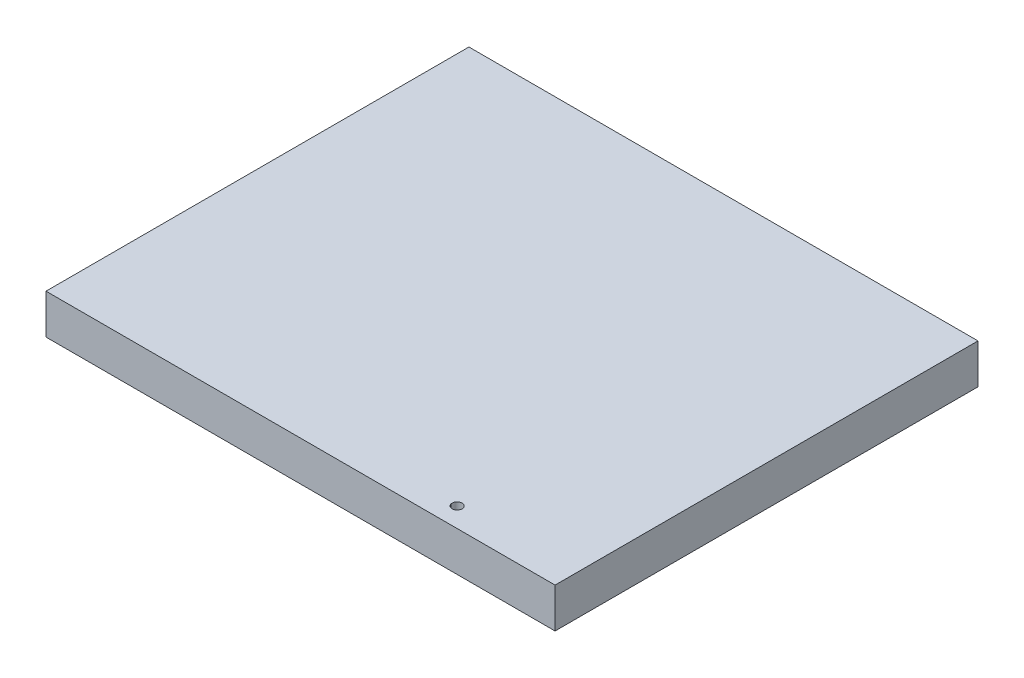
ISO-10303-21;
HEADER;
FILE_DESCRIPTION(('STEP AP214'),'2;1');
FILE_NAME('part.step','',(''),(''),'','','');
FILE_SCHEMA(('AUTOMOTIVE_DESIGN { 1 0 10303 214 1 1 1 1 }'));
ENDSEC;
DATA;
#1=APPLICATION_CONTEXT('core data for automotive mechanical design processes');
#2=APPLICATION_PROTOCOL_DEFINITION('international standard','automotive_design',2000,#1);
#3=PRODUCT_CONTEXT('',#1,'mechanical');
#4=PRODUCT('Part','Part','',(#3));
#5=PRODUCT_RELATED_PRODUCT_CATEGORY('part','',(#4));
#6=PRODUCT_DEFINITION_FORMATION('','',#4);
#7=PRODUCT_DEFINITION_CONTEXT('part definition',#1,'design');
#8=PRODUCT_DEFINITION('design','',#6,#7);
#9=PRODUCT_DEFINITION_SHAPE('','',#8);
#10=(LENGTH_UNIT() NAMED_UNIT(*) SI_UNIT(.MILLI.,.METRE.));
#11=(NAMED_UNIT(*) PLANE_ANGLE_UNIT() SI_UNIT($,.RADIAN.));
#12=(NAMED_UNIT(*) SI_UNIT($,.STERADIAN.) SOLID_ANGLE_UNIT());
#13=UNCERTAINTY_MEASURE_WITH_UNIT(LENGTH_MEASURE(1.E-05),#10,'distance_accuracy_value','');
#14=(GEOMETRIC_REPRESENTATION_CONTEXT(3) GLOBAL_UNCERTAINTY_ASSIGNED_CONTEXT((#13)) GLOBAL_UNIT_ASSIGNED_CONTEXT((#10,
#11,#12)) REPRESENTATION_CONTEXT('',''));
#15=CARTESIAN_POINT('',(0.,0.,0.));
#16=DIRECTION('',(0.,0.,1.));
#17=DIRECTION('',(1.,0.,0.));
#18=AXIS2_PLACEMENT_3D('',#15,#16,#17);
#19=CARTESIAN_POINT('',(-145.794398743962,25.4,-109.8836222286));
#20=DIRECTION('',(1.,0.,0.));
#21=DIRECTION('',(0.,0.,-1.));
#22=AXIS2_PLACEMENT_3D('',#19,#20,#21);
#23=PLANE('',#22);
#24=DIRECTION('',(0.,0.,1.));
#25=VECTOR('',#24,1.);
#26=CARTESIAN_POINT('',(-145.794398743962,0.,-109.8836222286));
#27=LINE('',#26,#25);
#28=CARTESIAN_POINT('',(-145.794398743962,0.,-109.8836222286));
#29=VERTEX_POINT('',#28);
#30=CARTESIAN_POINT('',(-145.794398743962,0.,160.1163777714));
#31=VERTEX_POINT('',#30);
#32=EDGE_CURVE('E96',#29,#31,#27,.T.);
#33=ORIENTED_EDGE('',*,*,#32,.T.);
#34=DIRECTION('',(0.,-1.,0.));
#35=VECTOR('',#34,1.);
#36=CARTESIAN_POINT('',(-145.794398743962,25.4,160.1163777714));
#37=LINE('',#36,#35);
#38=CARTESIAN_POINT('',(-145.794398743962,25.4,160.1163777714));
#39=VERTEX_POINT('',#38);
#40=EDGE_CURVE('E11',#39,#31,#37,.T.);
#41=ORIENTED_EDGE('',*,*,#40,.F.);
#42=DIRECTION('',(0.,0.,1.));
#43=VECTOR('',#42,1.);
#44=CARTESIAN_POINT('',(-145.794398743962,25.4,-109.8836222286));
#45=LINE('',#44,#43);
#46=CARTESIAN_POINT('',(-145.794398743962,25.4,-109.8836222286));
#47=VERTEX_POINT('',#46);
#48=EDGE_CURVE('E84',#47,#39,#45,.T.);
#49=ORIENTED_EDGE('',*,*,#48,.F.);
#50=DIRECTION('',(0.,-1.,0.));
#51=VECTOR('',#50,1.);
#52=CARTESIAN_POINT('',(-145.794398743962,25.4,-109.8836222286));
#53=LINE('',#52,#51);
#54=EDGE_CURVE('E92',#47,#29,#53,.T.);
#55=ORIENTED_EDGE('',*,*,#54,.T.);
#56=EDGE_LOOP('',(#33,#41,#49,#55));
#57=FACE_BOUND('',#56,.T.);
#58=ADVANCED_FACE('F33',(#57),#23,.F.);
#59=CARTESIAN_POINT('',(-145.794398743962,25.4,160.1163777714));
#60=DIRECTION('',(0.,0.,-1.));
#61=DIRECTION('',(-1.,0.,0.));
#62=AXIS2_PLACEMENT_3D('',#59,#60,#61);
#63=PLANE('',#62);
#64=DIRECTION('',(1.,0.,0.));
#65=VECTOR('',#64,1.);
#66=CARTESIAN_POINT('',(-145.794398743962,0.,160.1163777714));
#67=LINE('',#66,#65);
#68=CARTESIAN_POINT('',(179.205601256039,0.,160.1163777714));
#69=VERTEX_POINT('',#68);
#70=EDGE_CURVE('E88',#31,#69,#67,.T.);
#71=ORIENTED_EDGE('',*,*,#70,.T.);
#72=DIRECTION('',(0.,-1.,0.));
#73=VECTOR('',#72,1.);
#74=CARTESIAN_POINT('',(179.205601256039,25.4,160.1163777714));
#75=LINE('',#74,#73);
#76=CARTESIAN_POINT('',(179.205601256039,25.4,160.1163777714));
#77=VERTEX_POINT('',#76);
#78=EDGE_CURVE('E41',#77,#69,#75,.T.);
#79=ORIENTED_EDGE('',*,*,#78,.F.);
#80=DIRECTION('',(1.,0.,0.));
#81=VECTOR('',#80,1.);
#82=CARTESIAN_POINT('',(-145.794398743962,25.4,160.1163777714));
#83=LINE('',#82,#81);
#84=EDGE_CURVE('E79',#39,#77,#83,.T.);
#85=ORIENTED_EDGE('',*,*,#84,.F.);
#86=ORIENTED_EDGE('',*,*,#40,.T.);
#87=EDGE_LOOP('',(#71,#79,#85,#86));
#88=FACE_BOUND('',#87,.T.);
#89=ADVANCED_FACE('F87',(#88),#63,.F.);
#90=CARTESIAN_POINT('',(179.205601256039,25.4,-109.8836222286));
#91=DIRECTION('',(-1.,0.,0.));
#92=DIRECTION('',(0.,0.,1.));
#93=AXIS2_PLACEMENT_3D('',#90,#91,#92);
#94=PLANE('',#93);
#95=DIRECTION('',(0.,0.,-1.));
#96=VECTOR('',#95,1.);
#97=CARTESIAN_POINT('',(179.205601256039,0.,-109.8836222286));
#98=LINE('',#97,#96);
#99=CARTESIAN_POINT('',(179.205601256039,0.,-109.8836222286));
#100=VERTEX_POINT('',#99);
#101=EDGE_CURVE('E66',#69,#100,#98,.T.);
#102=ORIENTED_EDGE('',*,*,#101,.T.);
#103=DIRECTION('',(0.,-1.,0.));
#104=VECTOR('',#103,1.);
#105=CARTESIAN_POINT('',(179.205601256039,25.4,-109.8836222286));
#106=LINE('',#105,#104);
#107=CARTESIAN_POINT('',(179.205601256039,25.4,-109.8836222286));
#108=VERTEX_POINT('',#107);
#109=EDGE_CURVE('E89',#108,#100,#106,.T.);
#110=ORIENTED_EDGE('',*,*,#109,.F.);
#111=DIRECTION('',(0.,0.,-1.));
#112=VECTOR('',#111,1.);
#113=CARTESIAN_POINT('',(179.205601256039,25.4,-109.8836222286));
#114=LINE('',#113,#112);
#115=EDGE_CURVE('E82',#77,#108,#114,.T.);
#116=ORIENTED_EDGE('',*,*,#115,.F.);
#117=ORIENTED_EDGE('',*,*,#78,.T.);
#118=EDGE_LOOP('',(#102,#110,#116,#117));
#119=FACE_BOUND('',#118,.T.);
#120=ADVANCED_FACE('F90',(#119),#94,.F.);
#121=CARTESIAN_POINT('',(-145.794398743962,25.4,-109.8836222286));
#122=DIRECTION('',(0.,0.,1.));
#123=DIRECTION('',(1.,0.,0.));
#124=AXIS2_PLACEMENT_3D('',#121,#122,#123);
#125=PLANE('',#124);
#126=DIRECTION('',(-1.,0.,0.));
#127=VECTOR('',#126,1.);
#128=CARTESIAN_POINT('',(-145.794398743962,0.,-109.8836222286));
#129=LINE('',#128,#127);
#130=EDGE_CURVE('E72',#100,#29,#129,.T.);
#131=ORIENTED_EDGE('',*,*,#130,.T.);
#132=ORIENTED_EDGE('',*,*,#54,.F.);
#133=DIRECTION('',(-1.,0.,0.));
#134=VECTOR('',#133,1.);
#135=CARTESIAN_POINT('',(-145.794398743962,25.4,-109.8836222286));
#136=LINE('',#135,#134);
#137=EDGE_CURVE('E49',#108,#47,#136,.T.);
#138=ORIENTED_EDGE('',*,*,#137,.F.);
#139=ORIENTED_EDGE('',*,*,#109,.T.);
#140=EDGE_LOOP('',(#131,#132,#138,#139));
#141=FACE_BOUND('',#140,.T.);
#142=ADVANCED_FACE('F104',(#141),#125,.F.);
#143=CARTESIAN_POINT('',(0.,25.4,0.));
#144=DIRECTION('',(0.,1.,0.));
#145=DIRECTION('',(0.,0.,1.));
#146=AXIS2_PLACEMENT_3D('',#143,#144,#145);
#147=PLANE('',#146);
#148=CARTESIAN_POINT('',(104.205601256039,25.4,147.6163777714));
#149=DIRECTION('',(0.,1.,0.));
#150=DIRECTION('',(0.,0.,1.));
#151=AXIS2_PLACEMENT_3D('',#148,#149,#150);
#152=CIRCLE('',#151,3.20000000000001);
#153=CARTESIAN_POINT('',(104.205601256039,25.4,150.8163777714));
#154=VERTEX_POINT('',#153);
#155=EDGE_CURVE('E110',#154,#154,#152,.T.);
#156=ORIENTED_EDGE('',*,*,#155,.F.);
#157=EDGE_LOOP('',(#156));
#158=FACE_BOUND('',#157,.T.);
#159=ORIENTED_EDGE('',*,*,#48,.T.);
#160=ORIENTED_EDGE('',*,*,#84,.T.);
#161=ORIENTED_EDGE('',*,*,#115,.T.);
#162=ORIENTED_EDGE('',*,*,#137,.T.);
#163=EDGE_LOOP('',(#159,#160,#161,#162));
#164=FACE_BOUND('',#163,.T.);
#165=ADVANCED_FACE('F80',(#158,#164),#147,.T.);
#166=CARTESIAN_POINT('',(0.,0.,0.));
#167=DIRECTION('',(0.,1.,0.));
#168=DIRECTION('',(0.,0.,1.));
#169=AXIS2_PLACEMENT_3D('',#166,#167,#168);
#170=PLANE('',#169);
#171=CARTESIAN_POINT('',(104.205601256039,0.,147.6163777714));
#172=DIRECTION('',(0.,1.,0.));
#173=DIRECTION('',(0.,0.,1.));
#174=AXIS2_PLACEMENT_3D('',#171,#172,#173);
#175=CIRCLE('',#174,3.20000000000001);
#176=CARTESIAN_POINT('',(104.205601256039,0.,150.8163777714));
#177=VERTEX_POINT('',#176);
#178=EDGE_CURVE('E99',#177,#177,#175,.T.);
#179=ORIENTED_EDGE('',*,*,#178,.T.);
#180=EDGE_LOOP('',(#179));
#181=FACE_BOUND('',#180,.T.);
#182=ORIENTED_EDGE('',*,*,#32,.F.);
#183=ORIENTED_EDGE('',*,*,#130,.F.);
#184=ORIENTED_EDGE('',*,*,#101,.F.);
#185=ORIENTED_EDGE('',*,*,#70,.F.);
#186=EDGE_LOOP('',(#182,#183,#184,#185));
#187=FACE_BOUND('',#186,.T.);
#188=ADVANCED_FACE('F107',(#181,#187),#170,.F.);
#189=CARTESIAN_POINT('',(104.205601256039,0.,147.6163777714));
#190=DIRECTION('',(0.,1.,0.));
#191=DIRECTION('',(0.,0.,1.));
#192=AXIS2_PLACEMENT_3D('',#189,#190,#191);
#193=CYLINDRICAL_SURFACE('',#192,3.20000000000001);
#194=ORIENTED_EDGE('',*,*,#178,.F.);
#195=EDGE_LOOP('',(#194));
#196=FACE_BOUND('',#195,.T.);
#197=ORIENTED_EDGE('',*,*,#155,.T.);
#198=EDGE_LOOP('',(#197));
#199=FACE_BOUND('',#198,.T.);
#200=ADVANCED_FACE('F117',(#196,#199),#193,.F.);
#201=CLOSED_SHELL('',(#58,#89,#120,#142,#165,#188,#200));
#202=MANIFOLD_SOLID_BREP('B2',#201);
#203=ADVANCED_BREP_SHAPE_REPRESENTATION('',(#18,#202),#14);
#204=SHAPE_DEFINITION_REPRESENTATION(#9,#203);
ENDSEC;
END-ISO-10303-21;
